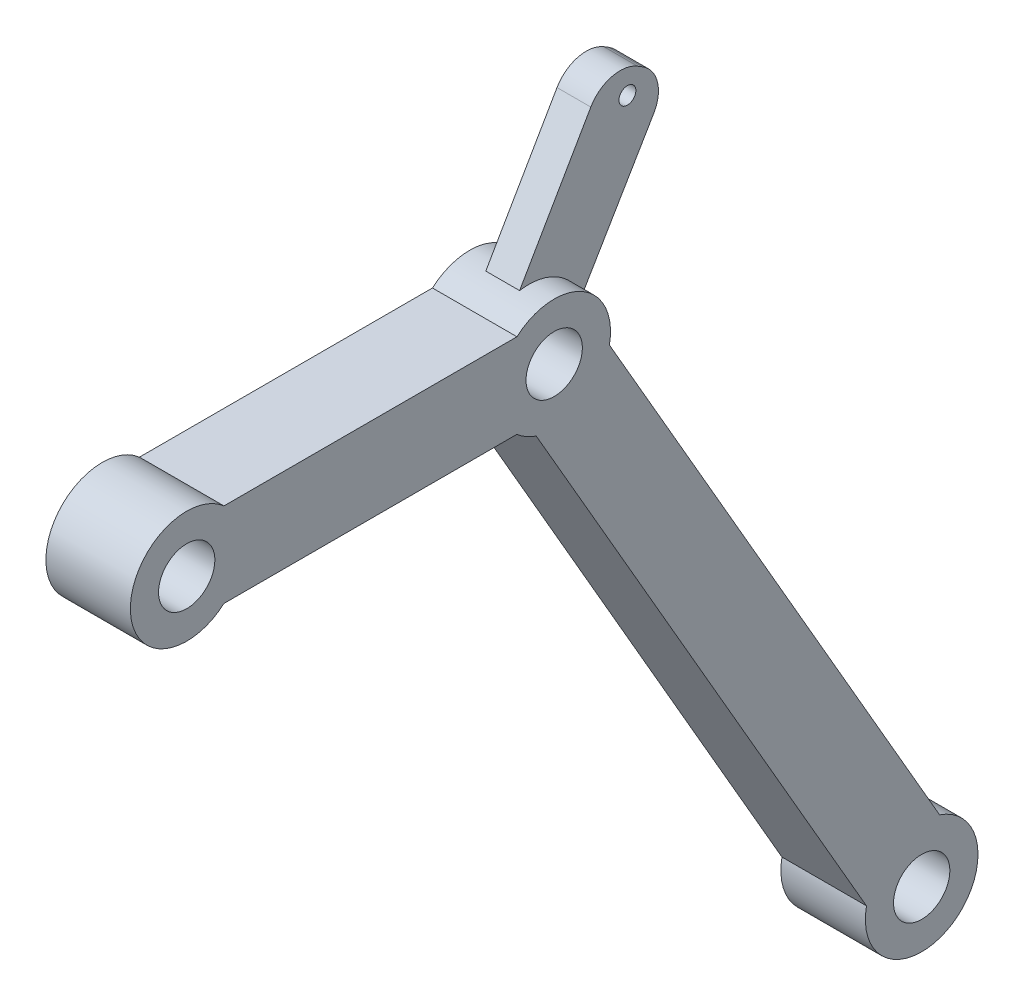
ISO-10303-21;
HEADER;
FILE_DESCRIPTION(('STEP AP214'),'2;1');
FILE_NAME('part.step','',(''),(''),'','','');
FILE_SCHEMA(('AUTOMOTIVE_DESIGN { 1 0 10303 214 1 1 1 1 }'));
ENDSEC;
DATA;
#1=APPLICATION_CONTEXT('core data for automotive mechanical design processes');
#2=APPLICATION_PROTOCOL_DEFINITION('international standard','automotive_design',2000,#1);
#3=PRODUCT_CONTEXT('',#1,'mechanical');
#4=PRODUCT('Part','Part','',(#3));
#5=PRODUCT_RELATED_PRODUCT_CATEGORY('part','',(#4));
#6=PRODUCT_DEFINITION_FORMATION('','',#4);
#7=PRODUCT_DEFINITION_CONTEXT('part definition',#1,'design');
#8=PRODUCT_DEFINITION('design','',#6,#7);
#9=PRODUCT_DEFINITION_SHAPE('','',#8);
#10=(LENGTH_UNIT() NAMED_UNIT(*) SI_UNIT(.MILLI.,.METRE.));
#11=(NAMED_UNIT(*) PLANE_ANGLE_UNIT() SI_UNIT($,.RADIAN.));
#12=(NAMED_UNIT(*) SI_UNIT($,.STERADIAN.) SOLID_ANGLE_UNIT());
#13=UNCERTAINTY_MEASURE_WITH_UNIT(LENGTH_MEASURE(1.E-05),#10,'distance_accuracy_value','');
#14=(GEOMETRIC_REPRESENTATION_CONTEXT(3) GLOBAL_UNCERTAINTY_ASSIGNED_CONTEXT((#13)) GLOBAL_UNIT_ASSIGNED_CONTEXT((#10,
#11,#12)) REPRESENTATION_CONTEXT('',''));
#15=CARTESIAN_POINT('',(0.,0.,0.));
#16=DIRECTION('',(0.,0.,1.));
#17=DIRECTION('',(1.,0.,0.));
#18=AXIS2_PLACEMENT_3D('',#15,#16,#17);
#19=CARTESIAN_POINT('',(-15.,0.,0.));
#20=DIRECTION('',(1.,0.,0.));
#21=DIRECTION('',(0.,1.,0.));
#22=AXIS2_PLACEMENT_3D('',#19,#20,#21);
#23=CYLINDRICAL_SURFACE('',#22,20.);
#24=CARTESIAN_POINT('',(6.,0.,0.));
#25=DIRECTION('',(1.,0.,0.));
#26=DIRECTION('',(0.,0.,-1.));
#27=AXIS2_PLACEMENT_3D('',#24,#25,#26);
#28=CIRCLE('',#27,20.);
#29=CARTESIAN_POINT('',(6.,19.7280323130776,3.28705659430512));
#30=VERTEX_POINT('',#29);
#31=CARTESIAN_POINT('',(6.,7.01734164219269,-18.7285054469583));
#32=VERTEX_POINT('',#31);
#33=EDGE_CURVE('E188',#30,#32,#28,.F.);
#34=ORIENTED_EDGE('',*,*,#33,.F.);
#35=DIRECTION('',(-1.,0.,0.));
#36=VECTOR('',#35,1.);
#37=CARTESIAN_POINT('',(6.,19.7280323130776,3.28705659430512));
#38=LINE('',#37,#36);
#39=CARTESIAN_POINT('',(-6.,19.7280323130776,3.28705659430513));
#40=VERTEX_POINT('',#39);
#41=EDGE_CURVE('E681',#30,#40,#38,.T.);
#42=ORIENTED_EDGE('',*,*,#41,.T.);
#43=CARTESIAN_POINT('',(-6.,0.,0.));
#44=DIRECTION('',(1.,0.,0.));
#45=DIRECTION('',(0.,0.,-1.));
#46=AXIS2_PLACEMENT_3D('',#43,#44,#45);
#47=CIRCLE('',#46,20.);
#48=CARTESIAN_POINT('',(-6.,7.01734164219269,-18.7285054469583));
#49=VERTEX_POINT('',#48);
#50=EDGE_CURVE('E200',#40,#49,#47,.F.);
#51=ORIENTED_EDGE('',*,*,#50,.T.);
#52=DIRECTION('',(-1.,0.,0.));
#53=VECTOR('',#52,1.);
#54=CARTESIAN_POINT('',(6.,7.01734164219269,-18.7285054469583));
#55=LINE('',#54,#53);
#56=EDGE_CURVE('E204',#32,#49,#55,.T.);
#57=ORIENTED_EDGE('',*,*,#56,.F.);
#58=EDGE_LOOP('',(#34,#42,#51,#57));
#59=FACE_BOUND('',#58,.T.);
#60=CARTESIAN_POINT('',(-15.,0.,0.));
#61=DIRECTION('',(1.,0.,0.));
#62=DIRECTION('',(0.,1.,0.));
#63=AXIS2_PLACEMENT_3D('',#60,#61,#62);
#64=CIRCLE('',#63,20.);
#65=CARTESIAN_POINT('',(-15.,-3.95643923738949,-19.6047593344281));
#66=VERTEX_POINT('',#65);
#67=CARTESIAN_POINT('',(-15.,15.,13.2287565553229));
#68=VERTEX_POINT('',#67);
#69=EDGE_CURVE('E274',#66,#68,#64,.T.);
#70=ORIENTED_EDGE('',*,*,#69,.T.);
#71=DIRECTION('',(1.,0.,0.));
#72=VECTOR('',#71,1.);
#73=CARTESIAN_POINT('',(-15.,15.,13.2287565553229));
#74=LINE('',#73,#72);
#75=CARTESIAN_POINT('',(15.,15.,13.2287565553229));
#76=VERTEX_POINT('',#75);
#77=EDGE_CURVE('E305',#76,#68,#74,.F.);
#78=ORIENTED_EDGE('',*,*,#77,.F.);
#79=CARTESIAN_POINT('',(15.,0.,0.));
#80=DIRECTION('',(1.,0.,0.));
#81=DIRECTION('',(0.,1.,0.));
#82=AXIS2_PLACEMENT_3D('',#79,#80,#81);
#83=CIRCLE('',#82,20.);
#84=CARTESIAN_POINT('',(15.,-3.95643923738949,-19.6047593344281));
#85=VERTEX_POINT('',#84);
#86=EDGE_CURVE('E273',#85,#76,#83,.T.);
#87=ORIENTED_EDGE('',*,*,#86,.F.);
#88=DIRECTION('',(1.,0.,0.));
#89=VECTOR('',#88,1.);
#90=CARTESIAN_POINT('',(-15.,-3.95643923738949,-19.6047593344281));
#91=LINE('',#90,#89);
#92=EDGE_CURVE('E307',#66,#85,#91,.T.);
#93=ORIENTED_EDGE('',*,*,#92,.F.);
#94=EDGE_LOOP('',(#70,#78,#87,#93));
#95=FACE_BOUND('',#94,.T.);
#96=ADVANCED_FACE('F38',(#59,#95),#23,.T.);
#97=CARTESIAN_POINT('',(-15.,0.836602540378331,17.803520777581));
#98=DIRECTION('',(0.,0.500000000000004,-0.866025403784436));
#99=DIRECTION('',(0.,0.866025403784436,0.500000000000004));
#100=AXIS2_PLACEMENT_3D('',#97,#98,#99);
#101=PLANE('',#100);
#102=DIRECTION('',(0.,-0.866025403784436,-0.500000000000004));
#103=VECTOR('',#102,1.);
#104=CARTESIAN_POINT('',(-15.,0.836602540378331,17.803520777581));
#105=LINE('',#104,#103);
#106=CARTESIAN_POINT('',(-15.,-18.9564392373896,6.37600277910499));
#107=VERTEX_POINT('',#106);
#108=CARTESIAN_POINT('',(-14.9999999999999,-222.076191150348,-110.895240665573));
#109=VERTEX_POINT('',#108);
#110=EDGE_CURVE('E349',#107,#109,#105,.T.);
#111=ORIENTED_EDGE('',*,*,#110,.T.);
#112=DIRECTION('',(1.,0.,0.));
#113=VECTOR('',#112,1.);
#114=CARTESIAN_POINT('',(-14.9999999999999,-222.076191150348,-110.895240665573));
#115=LINE('',#114,#113);
#116=CARTESIAN_POINT('',(15.0000000000001,-222.076191150348,-110.895240665573));
#117=VERTEX_POINT('',#116);
#118=EDGE_CURVE('E251',#109,#117,#115,.T.);
#119=ORIENTED_EDGE('',*,*,#118,.T.);
#120=DIRECTION('',(0.,-0.866025403784436,-0.500000000000004));
#121=VECTOR('',#120,1.);
#122=CARTESIAN_POINT('',(15.,0.836602540378331,17.803520777581));
#123=LINE('',#122,#121);
#124=CARTESIAN_POINT('',(15.,-18.9564392373896,6.37600277910499));
#125=VERTEX_POINT('',#124);
#126=EDGE_CURVE('E346',#125,#117,#123,.T.);
#127=ORIENTED_EDGE('',*,*,#126,.F.);
#128=DIRECTION('',(1.,0.,0.));
#129=VECTOR('',#128,1.);
#130=CARTESIAN_POINT('',(-15.,-18.9564392373896,6.37600277910498));
#131=LINE('',#130,#129);
#132=EDGE_CURVE('E309',#125,#107,#131,.F.);
#133=ORIENTED_EDGE('',*,*,#132,.T.);
#134=EDGE_LOOP('',(#111,#119,#127,#133));
#135=FACE_BOUND('',#134,.T.);
#136=ADVANCED_FACE('F403',(#135),#101,.F.);
#137=CARTESIAN_POINT('',(-15.,15.8366025403785,-8.17724133595211));
#138=DIRECTION('',(0.,-0.500000000000004,0.866025403784436));
#139=DIRECTION('',(0.,-0.866025403784436,-0.500000000000004));
#140=AXIS2_PLACEMENT_3D('',#137,#138,#139);
#141=PLANE('',#140);
#142=DIRECTION('',(0.,-0.866025403784436,-0.500000000000004));
#143=VECTOR('',#142,1.);
#144=CARTESIAN_POINT('',(15.,15.8366025403785,-8.17724133595211));
#145=LINE('',#144,#143);
#146=CARTESIAN_POINT('',(15.,-207.076191150348,-136.876002779106));
#147=VERTEX_POINT('',#146);
#148=EDGE_CURVE('E312',#85,#147,#145,.T.);
#149=ORIENTED_EDGE('',*,*,#148,.T.);
#150=DIRECTION('',(1.,0.,0.));
#151=VECTOR('',#150,1.);
#152=CARTESIAN_POINT('',(-14.9999999999999,-207.076191150348,-136.876002779106));
#153=LINE('',#152,#151);
#154=CARTESIAN_POINT('',(-14.9999999999999,-207.076191150348,-136.876002779106));
#155=VERTEX_POINT('',#154);
#156=EDGE_CURVE('E248',#147,#155,#153,.F.);
#157=ORIENTED_EDGE('',*,*,#156,.T.);
#158=DIRECTION('',(0.,-0.866025403784436,-0.500000000000004));
#159=VECTOR('',#158,1.);
#160=CARTESIAN_POINT('',(-15.,15.8366025403785,-8.17724133595211));
#161=LINE('',#160,#159);
#162=EDGE_CURVE('E341',#66,#155,#161,.T.);
#163=ORIENTED_EDGE('',*,*,#162,.F.);
#164=ORIENTED_EDGE('',*,*,#92,.T.);
#165=EDGE_LOOP('',(#149,#157,#163,#164));
#166=FACE_BOUND('',#165,.T.);
#167=ADVANCED_FACE('F40',(#166),#141,.F.);
#168=CARTESIAN_POINT('',(-15.,15.,130.5));
#169=DIRECTION('',(0.,-1.,0.));
#170=DIRECTION('',(0.,0.,-1.));
#171=AXIS2_PLACEMENT_3D('',#168,#169,#170);
#172=PLANE('',#171);
#173=DIRECTION('',(0.,0.,-1.));
#174=VECTOR('',#173,1.);
#175=CARTESIAN_POINT('',(-15.,15.,130.5));
#176=LINE('',#175,#174);
#177=CARTESIAN_POINT('',(-15.,15.,117.271243444677));
#178=VERTEX_POINT('',#177);
#179=EDGE_CURVE('E338',#178,#68,#176,.T.);
#180=ORIENTED_EDGE('',*,*,#179,.F.);
#181=DIRECTION('',(1.,0.,0.));
#182=VECTOR('',#181,1.);
#183=CARTESIAN_POINT('',(-15.,15.,117.271243444677));
#184=LINE('',#183,#182);
#185=CARTESIAN_POINT('',(15.,15.,117.271243444677));
#186=VERTEX_POINT('',#185);
#187=EDGE_CURVE('E271',#178,#186,#184,.T.);
#188=ORIENTED_EDGE('',*,*,#187,.T.);
#189=DIRECTION('',(0.,0.,-1.));
#190=VECTOR('',#189,1.);
#191=CARTESIAN_POINT('',(15.,15.,130.5));
#192=LINE('',#191,#190);
#193=EDGE_CURVE('E327',#186,#76,#192,.T.);
#194=ORIENTED_EDGE('',*,*,#193,.T.);
#195=ORIENTED_EDGE('',*,*,#77,.T.);
#196=EDGE_LOOP('',(#180,#188,#194,#195));
#197=FACE_BOUND('',#196,.T.);
#198=ADVANCED_FACE('F437',(#197),#172,.F.);
#199=CARTESIAN_POINT('',(15.,15.,130.5));
#200=DIRECTION('',(-1.,0.,0.));
#201=DIRECTION('',(0.,-1.,0.));
#202=AXIS2_PLACEMENT_3D('',#199,#200,#201);
#203=PLANE('',#202);
#204=CARTESIAN_POINT('',(15.0000000000001,-226.032630387738,-130.500000000001));
#205=DIRECTION('',(1.,0.,0.));
#206=DIRECTION('',(0.,1.,0.));
#207=AXIS2_PLACEMENT_3D('',#204,#205,#206);
#208=CIRCLE('',#207,10.);
#209=CARTESIAN_POINT('',(15.0000000000001,-216.032630387738,-130.500000000001));
#210=VERTEX_POINT('',#209);
#211=EDGE_CURVE('E199',#210,#210,#208,.T.);
#212=ORIENTED_EDGE('',*,*,#211,.F.);
#213=EDGE_LOOP('',(#212));
#214=FACE_BOUND('',#213,.T.);
#215=CARTESIAN_POINT('',(15.,0.,130.5));
#216=DIRECTION('',(1.,0.,0.));
#217=DIRECTION('',(0.,1.,0.));
#218=AXIS2_PLACEMENT_3D('',#215,#216,#217);
#219=CIRCLE('',#218,9.99999999999999);
#220=CARTESIAN_POINT('',(15.,9.99999999999999,130.5));
#221=VERTEX_POINT('',#220);
#222=EDGE_CURVE('E223',#221,#221,#219,.T.);
#223=ORIENTED_EDGE('',*,*,#222,.F.);
#224=EDGE_LOOP('',(#223));
#225=FACE_BOUND('',#224,.T.);
#226=CARTESIAN_POINT('',(15.,0.,0.));
#227=DIRECTION('',(1.,0.,0.));
#228=DIRECTION('',(0.,1.,0.));
#229=AXIS2_PLACEMENT_3D('',#226,#227,#228);
#230=CIRCLE('',#229,10.);
#231=CARTESIAN_POINT('',(15.,10.,0.));
#232=VERTEX_POINT('',#231);
#233=EDGE_CURVE('E222',#232,#232,#230,.T.);
#234=ORIENTED_EDGE('',*,*,#233,.F.);
#235=EDGE_LOOP('',(#234));
#236=FACE_BOUND('',#235,.T.);
#237=CARTESIAN_POINT('',(15.0000000000001,-226.032630387738,-130.500000000001));
#238=DIRECTION('',(1.,0.,0.));
#239=DIRECTION('',(0.,1.,0.));
#240=AXIS2_PLACEMENT_3D('',#237,#238,#239);
#241=CIRCLE('',#240,20.);
#242=EDGE_CURVE('E234',#117,#147,#241,.T.);
#243=ORIENTED_EDGE('',*,*,#242,.T.);
#244=ORIENTED_EDGE('',*,*,#148,.F.);
#245=ORIENTED_EDGE('',*,*,#86,.T.);
#246=ORIENTED_EDGE('',*,*,#193,.F.);
#247=CARTESIAN_POINT('',(15.,0.,130.5));
#248=DIRECTION('',(1.,0.,0.));
#249=DIRECTION('',(0.,1.,0.));
#250=AXIS2_PLACEMENT_3D('',#247,#248,#249);
#251=CIRCLE('',#250,20.);
#252=CARTESIAN_POINT('',(15.,-15.,117.271243444677));
#253=VERTEX_POINT('',#252);
#254=EDGE_CURVE('E254',#186,#253,#251,.T.);
#255=ORIENTED_EDGE('',*,*,#254,.T.);
#256=DIRECTION('',(0.,0.,-1.));
#257=VECTOR('',#256,1.);
#258=CARTESIAN_POINT('',(15.,-15.,130.5));
#259=LINE('',#258,#257);
#260=CARTESIAN_POINT('',(15.,-15.,13.228756555323));
#261=VERTEX_POINT('',#260);
#262=EDGE_CURVE('E337',#253,#261,#259,.T.);
#263=ORIENTED_EDGE('',*,*,#262,.T.);
#264=EDGE_CURVE('E278',#261,#125,#83,.T.);
#265=ORIENTED_EDGE('',*,*,#264,.T.);
#266=ORIENTED_EDGE('',*,*,#126,.T.);
#267=EDGE_LOOP('',(#243,#244,#245,#246,#255,#263,#265,#266));
#268=FACE_BOUND('',#267,.T.);
#269=ADVANCED_FACE('F429',(#214,#225,#236,#268),#203,.F.);
#270=CARTESIAN_POINT('',(-15.,-15.,130.5));
#271=DIRECTION('',(0.,1.,0.));
#272=DIRECTION('',(0.,0.,1.));
#273=AXIS2_PLACEMENT_3D('',#270,#271,#272);
#274=PLANE('',#273);
#275=ORIENTED_EDGE('',*,*,#262,.F.);
#276=DIRECTION('',(1.,0.,0.));
#277=VECTOR('',#276,1.);
#278=CARTESIAN_POINT('',(-15.,-15.,117.271243444677));
#279=LINE('',#278,#277);
#280=CARTESIAN_POINT('',(-15.,-15.,117.271243444677));
#281=VERTEX_POINT('',#280);
#282=EDGE_CURVE('E269',#253,#281,#279,.F.);
#283=ORIENTED_EDGE('',*,*,#282,.T.);
#284=DIRECTION('',(0.,0.,-1.));
#285=VECTOR('',#284,1.);
#286=CARTESIAN_POINT('',(-15.,-15.,130.5));
#287=LINE('',#286,#285);
#288=CARTESIAN_POINT('',(-15.,-15.,13.228756555323));
#289=VERTEX_POINT('',#288);
#290=EDGE_CURVE('E335',#281,#289,#287,.T.);
#291=ORIENTED_EDGE('',*,*,#290,.T.);
#292=DIRECTION('',(1.,0.,0.));
#293=VECTOR('',#292,1.);
#294=CARTESIAN_POINT('',(-15.,-15.,13.228756555323));
#295=LINE('',#294,#293);
#296=EDGE_CURVE('E302',#289,#261,#295,.T.);
#297=ORIENTED_EDGE('',*,*,#296,.T.);
#298=EDGE_LOOP('',(#275,#283,#291,#297));
#299=FACE_BOUND('',#298,.T.);
#300=ADVANCED_FACE('F423',(#299),#274,.F.);
#301=CARTESIAN_POINT('',(-15.,15.,130.5));
#302=DIRECTION('',(1.,0.,0.));
#303=DIRECTION('',(0.,0.,-1.));
#304=AXIS2_PLACEMENT_3D('',#301,#302,#303);
#305=PLANE('',#304);
#306=CARTESIAN_POINT('',(-14.9999999999999,-226.032630387738,-130.500000000001));
#307=DIRECTION('',(1.,0.,0.));
#308=DIRECTION('',(0.,1.,0.));
#309=AXIS2_PLACEMENT_3D('',#306,#307,#308);
#310=CIRCLE('',#309,10.);
#311=CARTESIAN_POINT('',(-14.9999999999999,-216.032630387738,-130.500000000001));
#312=VERTEX_POINT('',#311);
#313=EDGE_CURVE('E226',#312,#312,#310,.T.);
#314=ORIENTED_EDGE('',*,*,#313,.T.);
#315=EDGE_LOOP('',(#314));
#316=FACE_BOUND('',#315,.T.);
#317=CARTESIAN_POINT('',(-15.,0.,130.5));
#318=DIRECTION('',(1.,0.,0.));
#319=DIRECTION('',(0.,1.,0.));
#320=AXIS2_PLACEMENT_3D('',#317,#318,#319);
#321=CIRCLE('',#320,9.99999999999999);
#322=CARTESIAN_POINT('',(-15.,9.99999999999998,130.5));
#323=VERTEX_POINT('',#322);
#324=EDGE_CURVE('E219',#323,#323,#321,.T.);
#325=ORIENTED_EDGE('',*,*,#324,.T.);
#326=EDGE_LOOP('',(#325));
#327=FACE_BOUND('',#326,.T.);
#328=CARTESIAN_POINT('',(-15.,0.,0.));
#329=DIRECTION('',(1.,0.,0.));
#330=DIRECTION('',(0.,1.,0.));
#331=AXIS2_PLACEMENT_3D('',#328,#329,#330);
#332=CIRCLE('',#331,10.);
#333=CARTESIAN_POINT('',(-15.,10.,0.));
#334=VERTEX_POINT('',#333);
#335=EDGE_CURVE('E231',#334,#334,#332,.T.);
#336=ORIENTED_EDGE('',*,*,#335,.T.);
#337=EDGE_LOOP('',(#336));
#338=FACE_BOUND('',#337,.T.);
#339=ORIENTED_EDGE('',*,*,#162,.T.);
#340=CARTESIAN_POINT('',(-14.9999999999999,-226.032630387738,-130.500000000001));
#341=DIRECTION('',(1.,0.,0.));
#342=DIRECTION('',(0.,1.,0.));
#343=AXIS2_PLACEMENT_3D('',#340,#341,#342);
#344=CIRCLE('',#343,20.);
#345=EDGE_CURVE('E237',#109,#155,#344,.T.);
#346=ORIENTED_EDGE('',*,*,#345,.F.);
#347=ORIENTED_EDGE('',*,*,#110,.F.);
#348=EDGE_CURVE('E277',#289,#107,#64,.T.);
#349=ORIENTED_EDGE('',*,*,#348,.F.);
#350=ORIENTED_EDGE('',*,*,#290,.F.);
#351=CARTESIAN_POINT('',(-15.,0.,130.5));
#352=DIRECTION('',(1.,0.,0.));
#353=DIRECTION('',(0.,1.,0.));
#354=AXIS2_PLACEMENT_3D('',#351,#352,#353);
#355=CIRCLE('',#354,20.);
#356=EDGE_CURVE('E255',#178,#281,#355,.T.);
#357=ORIENTED_EDGE('',*,*,#356,.F.);
#358=ORIENTED_EDGE('',*,*,#179,.T.);
#359=ORIENTED_EDGE('',*,*,#69,.F.);
#360=EDGE_LOOP('',(#339,#346,#347,#349,#350,#357,#358,#359));
#361=FACE_BOUND('',#360,.T.);
#362=ADVANCED_FACE('F401',(#316,#327,#338,#361),#305,.F.);
#363=ORIENTED_EDGE('',*,*,#132,.F.);
#364=ORIENTED_EDGE('',*,*,#264,.F.);
#365=ORIENTED_EDGE('',*,*,#296,.F.);
#366=ORIENTED_EDGE('',*,*,#348,.T.);
#367=EDGE_LOOP('',(#363,#364,#365,#366));
#368=FACE_BOUND('',#367,.T.);
#369=ADVANCED_FACE('F390',(#368),#23,.T.);
#370=CARTESIAN_POINT('',(-15.,0.,130.5));
#371=DIRECTION('',(1.,0.,0.));
#372=DIRECTION('',(0.,1.,0.));
#373=AXIS2_PLACEMENT_3D('',#370,#371,#372);
#374=CYLINDRICAL_SURFACE('',#373,20.);
#375=ORIENTED_EDGE('',*,*,#187,.F.);
#376=ORIENTED_EDGE('',*,*,#356,.T.);
#377=ORIENTED_EDGE('',*,*,#282,.F.);
#378=ORIENTED_EDGE('',*,*,#254,.F.);
#379=EDGE_LOOP('',(#375,#376,#377,#378));
#380=FACE_BOUND('',#379,.T.);
#381=ADVANCED_FACE('F379',(#380),#374,.T.);
#382=CARTESIAN_POINT('',(-14.9999999999999,-226.032630387738,-130.500000000001));
#383=DIRECTION('',(1.,0.,0.));
#384=DIRECTION('',(0.,1.,0.));
#385=AXIS2_PLACEMENT_3D('',#382,#383,#384);
#386=CYLINDRICAL_SURFACE('',#385,20.);
#387=ORIENTED_EDGE('',*,*,#118,.F.);
#388=ORIENTED_EDGE('',*,*,#345,.T.);
#389=ORIENTED_EDGE('',*,*,#156,.F.);
#390=ORIENTED_EDGE('',*,*,#242,.F.);
#391=EDGE_LOOP('',(#387,#388,#389,#390));
#392=FACE_BOUND('',#391,.T.);
#393=ADVANCED_FACE('F389',(#392),#386,.T.);
#394=CARTESIAN_POINT('',(-15.,0.,0.));
#395=DIRECTION('',(1.,0.,0.));
#396=DIRECTION('',(0.,1.,0.));
#397=AXIS2_PLACEMENT_3D('',#394,#395,#396);
#398=CYLINDRICAL_SURFACE('',#397,10.);
#399=ORIENTED_EDGE('',*,*,#233,.T.);
#400=EDGE_LOOP('',(#399));
#401=FACE_BOUND('',#400,.T.);
#402=ORIENTED_EDGE('',*,*,#335,.F.);
#403=EDGE_LOOP('',(#402));
#404=FACE_BOUND('',#403,.T.);
#405=ADVANCED_FACE('F467',(#401,#404),#398,.F.);
#406=CARTESIAN_POINT('',(-15.,0.,130.5));
#407=DIRECTION('',(1.,0.,0.));
#408=DIRECTION('',(0.,1.,0.));
#409=AXIS2_PLACEMENT_3D('',#406,#407,#408);
#410=CYLINDRICAL_SURFACE('',#409,9.99999999999999);
#411=ORIENTED_EDGE('',*,*,#324,.F.);
#412=EDGE_LOOP('',(#411));
#413=FACE_BOUND('',#412,.T.);
#414=ORIENTED_EDGE('',*,*,#222,.T.);
#415=EDGE_LOOP('',(#414));
#416=FACE_BOUND('',#415,.T.);
#417=ADVANCED_FACE('F472',(#413,#416),#410,.F.);
#418=CARTESIAN_POINT('',(-14.9999999999999,-226.032630387738,-130.500000000001));
#419=DIRECTION('',(1.,0.,0.));
#420=DIRECTION('',(0.,1.,0.));
#421=AXIS2_PLACEMENT_3D('',#418,#419,#420);
#422=CYLINDRICAL_SURFACE('',#421,10.);
#423=ORIENTED_EDGE('',*,*,#313,.F.);
#424=EDGE_LOOP('',(#423));
#425=FACE_BOUND('',#424,.T.);
#426=ORIENTED_EDGE('',*,*,#211,.T.);
#427=EDGE_LOOP('',(#426));
#428=FACE_BOUND('',#427,.T.);
#429=ADVANCED_FACE('F572',(#425,#428),#422,.F.);
#430=CARTESIAN_POINT('',(6.,0.,0.));
#431=DIRECTION('',(1.,0.,0.));
#432=DIRECTION('',(0.,0.,-1.));
#433=AXIS2_PLACEMENT_3D('',#430,#431,#432);
#434=PLANE('',#433);
#435=DIRECTION('',(0.,-0.86602540378444,0.499999999999998));
#436=VECTOR('',#435,1.);
#437=CARTESIAN_POINT('',(6.,19.7280323130776,3.28705659430512));
#438=LINE('',#437,#436);
#439=CARTESIAN_POINT('',(6.,63.5269656760281,-22.0002693730127));
#440=VERTEX_POINT('',#439);
#441=EDGE_CURVE('E195',#440,#30,#438,.T.);
#442=ORIENTED_EDGE('',*,*,#441,.T.);
#443=ORIENTED_EDGE('',*,*,#33,.T.);
#444=DIRECTION('',(0.,0.861010443447098,-0.508587274983391));
#445=VECTOR('',#444,1.);
#446=CARTESIAN_POINT('',(6.,50.4217740311825,-44.366919195506));
#447=LINE('',#446,#445);
#448=CARTESIAN_POINT('',(6.,50.4217740311825,-44.366919195506));
#449=VERTEX_POINT('',#448);
#450=EDGE_CURVE('E192',#32,#449,#447,.T.);
#451=ORIENTED_EDGE('',*,*,#450,.T.);
#452=CARTESIAN_POINT('',(6.,56.5248213309832,-34.0347938741408));
#453=DIRECTION('',(1.,0.,0.));
#454=DIRECTION('',(0.,0.,1.));
#455=AXIS2_PLACEMENT_3D('',#452,#453,#454);
#456=CIRCLE('',#455,12.);
#457=CARTESIAN_POINT('',(6.,66.7681820276705,-40.2856787425064));
#458=VERTEX_POINT('',#457);
#459=EDGE_CURVE('E209',#449,#458,#456,.T.);
#460=ORIENTED_EDGE('',*,*,#459,.T.);
#461=DIRECTION('',(0.,0.520907072363805,0.853613391390605));
#462=VECTOR('',#461,1.);
#463=CARTESIAN_POINT('',(6.,67.7703263727155,-38.6434590867915));
#464=LINE('',#463,#462);
#465=CARTESIAN_POINT('',(6.,67.7703263727155,-38.6434590867915));
#466=VERTEX_POINT('',#465);
#467=EDGE_CURVE('E676',#458,#466,#464,.T.);
#468=ORIENTED_EDGE('',*,*,#467,.T.);
#469=CARTESIAN_POINT('',(6.,57.5269656760282,-32.3925742184259));
#470=DIRECTION('',(1.,0.,0.));
#471=DIRECTION('',(0.,0.,1.));
#472=AXIS2_PLACEMENT_3D('',#469,#470,#471);
#473=CIRCLE('',#472,12.);
#474=EDGE_CURVE('E678',#466,#440,#473,.T.);
#475=ORIENTED_EDGE('',*,*,#474,.T.);
#476=EDGE_LOOP('',(#442,#443,#451,#460,#468,#475));
#477=FACE_BOUND('',#476,.T.);
#478=CARTESIAN_POINT('',(6.,60.6217782649108,-34.9999999999998));
#479=DIRECTION('',(1.,0.,0.));
#480=DIRECTION('',(0.,0.,-1.));
#481=AXIS2_PLACEMENT_3D('',#478,#479,#480);
#482=CIRCLE('',#481,3.);
#483=CARTESIAN_POINT('',(6.,60.6217782649108,-37.9999999999998));
#484=VERTEX_POINT('',#483);
#485=EDGE_CURVE('E666',#484,#484,#482,.T.);
#486=ORIENTED_EDGE('',*,*,#485,.F.);
#487=EDGE_LOOP('',(#486));
#488=FACE_BOUND('',#487,.T.);
#489=ADVANCED_FACE('F190',(#477,#488),#434,.T.);
#490=CARTESIAN_POINT('',(-6.,0.,0.));
#491=DIRECTION('',(1.,0.,0.));
#492=DIRECTION('',(0.,0.,-1.));
#493=AXIS2_PLACEMENT_3D('',#490,#491,#492);
#494=PLANE('',#493);
#495=ORIENTED_EDGE('',*,*,#50,.F.);
#496=DIRECTION('',(0.,-0.86602540378444,0.499999999999998));
#497=VECTOR('',#496,1.);
#498=CARTESIAN_POINT('',(-6.,19.7280323130776,3.28705659430512));
#499=LINE('',#498,#497);
#500=CARTESIAN_POINT('',(-6.,63.5269656760281,-22.0002693730127));
#501=VERTEX_POINT('',#500);
#502=EDGE_CURVE('E54',#501,#40,#499,.T.);
#503=ORIENTED_EDGE('',*,*,#502,.F.);
#504=CARTESIAN_POINT('',(-6.,57.5269656760282,-32.3925742184259));
#505=DIRECTION('',(1.,0.,0.));
#506=DIRECTION('',(0.,0.,1.));
#507=AXIS2_PLACEMENT_3D('',#504,#505,#506);
#508=CIRCLE('',#507,12.);
#509=CARTESIAN_POINT('',(-6.,67.7703263727155,-38.6434590867915));
#510=VERTEX_POINT('',#509);
#511=EDGE_CURVE('E687',#510,#501,#508,.T.);
#512=ORIENTED_EDGE('',*,*,#511,.F.);
#513=DIRECTION('',(0.,0.520907072363805,0.853613391390605));
#514=VECTOR('',#513,1.);
#515=CARTESIAN_POINT('',(-6.,67.7703263727155,-38.6434590867915));
#516=LINE('',#515,#514);
#517=CARTESIAN_POINT('',(-6.,66.7681820276705,-40.2856787425064));
#518=VERTEX_POINT('',#517);
#519=EDGE_CURVE('E685',#518,#510,#516,.T.);
#520=ORIENTED_EDGE('',*,*,#519,.F.);
#521=CARTESIAN_POINT('',(-6.,56.5248213309832,-34.0347938741408));
#522=DIRECTION('',(1.,0.,0.));
#523=DIRECTION('',(0.,0.,1.));
#524=AXIS2_PLACEMENT_3D('',#521,#522,#523);
#525=CIRCLE('',#524,12.);
#526=CARTESIAN_POINT('',(-6.,50.4217740311825,-44.366919195506));
#527=VERTEX_POINT('',#526);
#528=EDGE_CURVE('E683',#527,#518,#525,.T.);
#529=ORIENTED_EDGE('',*,*,#528,.F.);
#530=DIRECTION('',(0.,0.861010443447098,-0.508587274983391));
#531=VECTOR('',#530,1.);
#532=CARTESIAN_POINT('',(-6.,50.4217740311825,-44.366919195506));
#533=LINE('',#532,#531);
#534=EDGE_CURVE('E672',#49,#527,#533,.T.);
#535=ORIENTED_EDGE('',*,*,#534,.F.);
#536=EDGE_LOOP('',(#495,#503,#512,#520,#529,#535));
#537=FACE_BOUND('',#536,.T.);
#538=CARTESIAN_POINT('',(-6.,60.6217782649108,-34.9999999999998));
#539=DIRECTION('',(1.,0.,0.));
#540=DIRECTION('',(0.,0.,-1.));
#541=AXIS2_PLACEMENT_3D('',#538,#539,#540);
#542=CIRCLE('',#541,3.);
#543=CARTESIAN_POINT('',(-6.,60.6217782649108,-37.9999999999998));
#544=VERTEX_POINT('',#543);
#545=EDGE_CURVE('E669',#544,#544,#542,.T.);
#546=ORIENTED_EDGE('',*,*,#545,.T.);
#547=EDGE_LOOP('',(#546));
#548=FACE_BOUND('',#547,.T.);
#549=ADVANCED_FACE('F594',(#537,#548),#494,.F.);
#550=CARTESIAN_POINT('',(6.,50.4217740311825,-44.366919195506));
#551=DIRECTION('',(0.,0.508587274983391,0.861010443447098));
#552=DIRECTION('',(0.,-0.861010443447098,0.508587274983391));
#553=AXIS2_PLACEMENT_3D('',#550,#551,#552);
#554=PLANE('',#553);
#555=ORIENTED_EDGE('',*,*,#534,.T.);
#556=DIRECTION('',(-1.,0.,0.));
#557=VECTOR('',#556,1.);
#558=CARTESIAN_POINT('',(6.,50.4217740311825,-44.366919195506));
#559=LINE('',#558,#557);
#560=EDGE_CURVE('E207',#449,#527,#559,.T.);
#561=ORIENTED_EDGE('',*,*,#560,.F.);
#562=ORIENTED_EDGE('',*,*,#450,.F.);
#563=ORIENTED_EDGE('',*,*,#56,.T.);
#564=EDGE_LOOP('',(#555,#561,#562,#563));
#565=FACE_BOUND('',#564,.T.);
#566=ADVANCED_FACE('F203',(#565),#554,.F.);
#567=CARTESIAN_POINT('',(6.,56.5248213309832,-34.0347938741408));
#568=DIRECTION('',(-1.,0.,0.));
#569=DIRECTION('',(0.,0.,1.));
#570=AXIS2_PLACEMENT_3D('',#567,#568,#569);
#571=CYLINDRICAL_SURFACE('',#570,12.);
#572=ORIENTED_EDGE('',*,*,#528,.T.);
#573=DIRECTION('',(-1.,0.,0.));
#574=VECTOR('',#573,1.);
#575=CARTESIAN_POINT('',(6.,66.7681820276705,-40.2856787425064));
#576=LINE('',#575,#574);
#577=EDGE_CURVE('E215',#458,#518,#576,.T.);
#578=ORIENTED_EDGE('',*,*,#577,.F.);
#579=ORIENTED_EDGE('',*,*,#459,.F.);
#580=ORIENTED_EDGE('',*,*,#560,.T.);
#581=EDGE_LOOP('',(#572,#578,#579,#580));
#582=FACE_BOUND('',#581,.T.);
#583=ADVANCED_FACE('F610',(#582),#571,.T.);
#584=CARTESIAN_POINT('',(6.,67.7703263727155,-38.6434590867915));
#585=DIRECTION('',(0.,-0.853613391390605,0.520907072363805));
#586=DIRECTION('',(0.,-0.520907072363805,-0.853613391390605));
#587=AXIS2_PLACEMENT_3D('',#584,#585,#586);
#588=PLANE('',#587);
#589=ORIENTED_EDGE('',*,*,#519,.T.);
#590=DIRECTION('',(-1.,0.,0.));
#591=VECTOR('',#590,1.);
#592=CARTESIAN_POINT('',(6.,67.7703263727155,-38.6434590867915));
#593=LINE('',#592,#591);
#594=EDGE_CURVE('E693',#466,#510,#593,.T.);
#595=ORIENTED_EDGE('',*,*,#594,.F.);
#596=ORIENTED_EDGE('',*,*,#467,.F.);
#597=ORIENTED_EDGE('',*,*,#577,.T.);
#598=EDGE_LOOP('',(#589,#595,#596,#597));
#599=FACE_BOUND('',#598,.T.);
#600=ADVANCED_FACE('F618',(#599),#588,.F.);
#601=CARTESIAN_POINT('',(6.,57.5269656760282,-32.3925742184259));
#602=DIRECTION('',(-1.,0.,0.));
#603=DIRECTION('',(0.,0.,1.));
#604=AXIS2_PLACEMENT_3D('',#601,#602,#603);
#605=CYLINDRICAL_SURFACE('',#604,12.);
#606=ORIENTED_EDGE('',*,*,#511,.T.);
#607=DIRECTION('',(-1.,0.,0.));
#608=VECTOR('',#607,1.);
#609=CARTESIAN_POINT('',(6.,63.5269656760281,-22.0002693730127));
#610=LINE('',#609,#608);
#611=EDGE_CURVE('E691',#440,#501,#610,.T.);
#612=ORIENTED_EDGE('',*,*,#611,.F.);
#613=ORIENTED_EDGE('',*,*,#474,.F.);
#614=ORIENTED_EDGE('',*,*,#594,.T.);
#615=EDGE_LOOP('',(#606,#612,#613,#614));
#616=FACE_BOUND('',#615,.T.);
#617=ADVANCED_FACE('F627',(#616),#605,.T.);
#618=CARTESIAN_POINT('',(6.,19.7280323130776,3.28705659430512));
#619=DIRECTION('',(0.,-0.499999999999998,-0.86602540378444));
#620=DIRECTION('',(0.,0.86602540378444,-0.499999999999998));
#621=AXIS2_PLACEMENT_3D('',#618,#619,#620);
#622=PLANE('',#621);
#623=ORIENTED_EDGE('',*,*,#502,.T.);
#624=ORIENTED_EDGE('',*,*,#41,.F.);
#625=ORIENTED_EDGE('',*,*,#441,.F.);
#626=ORIENTED_EDGE('',*,*,#611,.T.);
#627=EDGE_LOOP('',(#623,#624,#625,#626));
#628=FACE_BOUND('',#627,.T.);
#629=ADVANCED_FACE('F636',(#628),#622,.F.);
#630=CARTESIAN_POINT('',(6.,60.6217782649108,-34.9999999999998));
#631=DIRECTION('',(-1.,0.,0.));
#632=DIRECTION('',(0.,0.,1.));
#633=AXIS2_PLACEMENT_3D('',#630,#631,#632);
#634=CYLINDRICAL_SURFACE('',#633,3.);
#635=ORIENTED_EDGE('',*,*,#485,.T.);
#636=EDGE_LOOP('',(#635));
#637=FACE_BOUND('',#636,.T.);
#638=ORIENTED_EDGE('',*,*,#545,.F.);
#639=EDGE_LOOP('',(#638));
#640=FACE_BOUND('',#639,.T.);
#641=ADVANCED_FACE('F645',(#637,#640),#634,.F.);
#642=CLOSED_SHELL('',(#96,#136,#167,#198,#269,#300,#362,#369,#381,#393,#405,#417,#429,#489,#549,
#566,#583,#600,#617,#629,#641));
#643=CARTESIAN_POINT('',(12.5,0.,0.));
#644=DIRECTION('',(1.,0.,0.));
#645=DIRECTION('',(0.,0.,-1.));
#646=AXIS2_PLACEMENT_3D('',#643,#644,#645);
#647=CIRCLE('',#646,20.);
#648=CARTESIAN_POINT('',(12.5,-19.77081728299,3.01907004930736));
#649=VERTEX_POINT('',#648);
#650=CARTESIAN_POINT('',(12.5,-7.27081728298985,-18.6315650453035));
#651=VERTEX_POINT('',#650);
#652=EDGE_CURVE('E299',#649,#651,#647,.T.);
#653=ORIENTED_EDGE('',*,*,#652,.F.);
#654=DIRECTION('',(1.,0.,0.));
#655=VECTOR('',#654,1.);
#656=CARTESIAN_POINT('',(-15.,-19.77081728299,3.01907004930736));
#657=LINE('',#656,#655);
#658=CARTESIAN_POINT('',(-12.5,-19.77081728299,3.01907004930736));
#659=VERTEX_POINT('',#658);
#660=EDGE_CURVE('E296',#659,#649,#657,.T.);
#661=ORIENTED_EDGE('',*,*,#660,.F.);
#662=CARTESIAN_POINT('',(-12.5,0.,0.));
#663=DIRECTION('',(-1.,0.,0.));
#664=DIRECTION('',(0.,0.,1.));
#665=AXIS2_PLACEMENT_3D('',#662,#663,#664);
#666=CIRCLE('',#665,20.);
#667=CARTESIAN_POINT('',(-12.5,-7.27081728298985,-18.6315650453035));
#668=VERTEX_POINT('',#667);
#669=EDGE_CURVE('E293',#668,#659,#666,.T.);
#670=ORIENTED_EDGE('',*,*,#669,.F.);
#671=DIRECTION('',(1.,0.,0.));
#672=VECTOR('',#671,1.);
#673=CARTESIAN_POINT('',(-15.,-7.27081728298986,-18.6315650453035));
#674=LINE('',#673,#672);
#675=EDGE_CURVE('E290',#651,#668,#674,.F.);
#676=ORIENTED_EDGE('',*,*,#675,.F.);
#677=EDGE_LOOP('',(#653,#661,#670,#676));
#678=FACE_BOUND('',#677,.T.);
#679=ADVANCED_FACE('F394',(#678),#23,.T.);
#680=CARTESIAN_POINT('',(-12.5,13.2116025403785,-6.80603444662677));
#681=DIRECTION('',(0.,0.500000000000004,-0.866025403784436));
#682=DIRECTION('',(0.,0.866025403784436,0.500000000000004));
#683=AXIS2_PLACEMENT_3D('',#680,#681,#682);
#684=PLANE('',#683);
#685=DIRECTION('',(0.,-0.866025403784436,-0.500000000000004));
#686=VECTOR('',#685,1.);
#687=CARTESIAN_POINT('',(-12.5,13.2116025403785,-6.80603444662677));
#688=LINE('',#687,#686);
#689=CARTESIAN_POINT('',(-12.5,-206.261813104748,-133.519070049309));
#690=VERTEX_POINT('',#689);
#691=EDGE_CURVE('E323',#668,#690,#688,.T.);
#692=ORIENTED_EDGE('',*,*,#691,.T.);
#693=DIRECTION('',(1.,0.,0.));
#694=VECTOR('',#693,1.);
#695=CARTESIAN_POINT('',(-14.9999999999999,-206.261813104748,-133.519070049309));
#696=LINE('',#695,#694);
#697=CARTESIAN_POINT('',(12.5,-206.261813104748,-133.519070049309));
#698=VERTEX_POINT('',#697);
#699=EDGE_CURVE('E11',#690,#698,#696,.T.);
#700=ORIENTED_EDGE('',*,*,#699,.T.);
#701=DIRECTION('',(0.,-0.866025403784436,-0.500000000000004));
#702=VECTOR('',#701,1.);
#703=CARTESIAN_POINT('',(12.5,13.2116025403785,-6.80603444662677));
#704=LINE('',#703,#702);
#705=EDGE_CURVE('E318',#651,#698,#704,.T.);
#706=ORIENTED_EDGE('',*,*,#705,.F.);
#707=ORIENTED_EDGE('',*,*,#675,.T.);
#708=EDGE_LOOP('',(#692,#700,#706,#707));
#709=FACE_BOUND('',#708,.T.);
#710=ADVANCED_FACE('F405',(#709),#684,.F.);
#711=CARTESIAN_POINT('',(-12.5,13.2116025403785,-6.80603444662677));
#712=DIRECTION('',(-1.,0.,0.));
#713=DIRECTION('',(0.,0.,1.));
#714=AXIS2_PLACEMENT_3D('',#711,#712,#713);
#715=PLANE('',#714);
#716=DIRECTION('',(0.,-0.866025403784436,-0.500000000000004));
#717=VECTOR('',#716,1.);
#718=CARTESIAN_POINT('',(-12.5,0.711602540378359,14.8446006479841));
#719=LINE('',#718,#717);
#720=CARTESIAN_POINT('',(-12.5,-218.761813104748,-111.868434954698));
#721=VERTEX_POINT('',#720);
#722=EDGE_CURVE('E326',#659,#721,#719,.T.);
#723=ORIENTED_EDGE('',*,*,#722,.T.);
#724=CARTESIAN_POINT('',(-12.5,-226.032630387738,-130.500000000001));
#725=DIRECTION('',(-1.,0.,0.));
#726=DIRECTION('',(0.,0.,1.));
#727=AXIS2_PLACEMENT_3D('',#724,#725,#726);
#728=CIRCLE('',#727,20.);
#729=EDGE_CURVE('E239',#721,#690,#728,.T.);
#730=ORIENTED_EDGE('',*,*,#729,.T.);
#731=ORIENTED_EDGE('',*,*,#691,.F.);
#732=ORIENTED_EDGE('',*,*,#669,.T.);
#733=EDGE_LOOP('',(#723,#730,#731,#732));
#734=FACE_BOUND('',#733,.T.);
#735=ADVANCED_FACE('F412',(#734),#715,.F.);
#736=CARTESIAN_POINT('',(-12.5,0.711602540378359,14.8446006479841));
#737=DIRECTION('',(0.,-0.500000000000004,0.866025403784436));
#738=DIRECTION('',(0.,-0.866025403784436,-0.500000000000004));
#739=AXIS2_PLACEMENT_3D('',#736,#737,#738);
#740=PLANE('',#739);
#741=DIRECTION('',(0.,-0.866025403784436,-0.500000000000004));
#742=VECTOR('',#741,1.);
#743=CARTESIAN_POINT('',(12.5,0.711602540378359,14.8446006479841));
#744=LINE('',#743,#742);
#745=CARTESIAN_POINT('',(12.5,-218.761813104748,-111.868434954698));
#746=VERTEX_POINT('',#745);
#747=EDGE_CURVE('E330',#649,#746,#744,.T.);
#748=ORIENTED_EDGE('',*,*,#747,.T.);
#749=DIRECTION('',(1.,0.,0.));
#750=VECTOR('',#749,1.);
#751=CARTESIAN_POINT('',(-14.9999999999999,-218.761813104748,-111.868434954698));
#752=LINE('',#751,#750);
#753=EDGE_CURVE('E244',#746,#721,#752,.F.);
#754=ORIENTED_EDGE('',*,*,#753,.T.);
#755=ORIENTED_EDGE('',*,*,#722,.F.);
#756=ORIENTED_EDGE('',*,*,#660,.T.);
#757=EDGE_LOOP('',(#748,#754,#755,#756));
#758=FACE_BOUND('',#757,.T.);
#759=ADVANCED_FACE('F479',(#758),#740,.F.);
#760=CARTESIAN_POINT('',(12.5,13.2116025403785,-6.80603444662677));
#761=DIRECTION('',(1.,0.,0.));
#762=DIRECTION('',(0.,0.,-1.));
#763=AXIS2_PLACEMENT_3D('',#760,#761,#762);
#764=PLANE('',#763);
#765=ORIENTED_EDGE('',*,*,#705,.T.);
#766=CARTESIAN_POINT('',(12.5,-226.032630387738,-130.500000000001));
#767=DIRECTION('',(1.,0.,0.));
#768=DIRECTION('',(0.,0.,-1.));
#769=AXIS2_PLACEMENT_3D('',#766,#767,#768);
#770=CIRCLE('',#769,20.);
#771=EDGE_CURVE('E62',#698,#746,#770,.T.);
#772=ORIENTED_EDGE('',*,*,#771,.T.);
#773=ORIENTED_EDGE('',*,*,#747,.F.);
#774=ORIENTED_EDGE('',*,*,#652,.T.);
#775=EDGE_LOOP('',(#765,#772,#773,#774));
#776=FACE_BOUND('',#775,.T.);
#777=ADVANCED_FACE('F475',(#776),#764,.F.);
#778=ORIENTED_EDGE('',*,*,#771,.F.);
#779=ORIENTED_EDGE('',*,*,#699,.F.);
#780=ORIENTED_EDGE('',*,*,#729,.F.);
#781=ORIENTED_EDGE('',*,*,#753,.F.);
#782=EDGE_LOOP('',(#778,#779,#780,#781));
#783=FACE_BOUND('',#782,.T.);
#784=ADVANCED_FACE('F468',(#783),#386,.T.);
#785=CLOSED_SHELL('',(#679,#710,#735,#759,#777,#784));
#786=DIRECTION('',(1.,0.,0.));
#787=VECTOR('',#786,1.);
#788=CARTESIAN_POINT('',(-15.,12.5,15.612494995996));
#789=LINE('',#788,#787);
#790=CARTESIAN_POINT('',(-12.5,12.5,15.612494995996));
#791=VERTEX_POINT('',#790);
#792=CARTESIAN_POINT('',(12.5,12.5,15.612494995996));
#793=VERTEX_POINT('',#792);
#794=EDGE_CURVE('E287',#791,#793,#789,.T.);
#795=ORIENTED_EDGE('',*,*,#794,.F.);
#796=CARTESIAN_POINT('',(-12.5,0.,0.));
#797=DIRECTION('',(-1.,0.,0.));
#798=DIRECTION('',(0.,0.,1.));
#799=AXIS2_PLACEMENT_3D('',#796,#797,#798);
#800=CIRCLE('',#799,20.);
#801=CARTESIAN_POINT('',(-12.5,-12.5,15.612494995996));
#802=VERTEX_POINT('',#801);
#803=EDGE_CURVE('E284',#802,#791,#800,.T.);
#804=ORIENTED_EDGE('',*,*,#803,.F.);
#805=DIRECTION('',(1.,0.,0.));
#806=VECTOR('',#805,1.);
#807=CARTESIAN_POINT('',(-15.,-12.5,15.612494995996));
#808=LINE('',#807,#806);
#809=CARTESIAN_POINT('',(12.5,-12.5,15.612494995996));
#810=VERTEX_POINT('',#809);
#811=EDGE_CURVE('E281',#810,#802,#808,.F.);
#812=ORIENTED_EDGE('',*,*,#811,.F.);
#813=CARTESIAN_POINT('',(12.5,0.,0.));
#814=DIRECTION('',(1.,0.,0.));
#815=DIRECTION('',(0.,1.,0.));
#816=AXIS2_PLACEMENT_3D('',#813,#814,#815);
#817=CIRCLE('',#816,20.);
#818=EDGE_CURVE('E322',#793,#810,#817,.T.);
#819=ORIENTED_EDGE('',*,*,#818,.F.);
#820=EDGE_LOOP('',(#795,#804,#812,#819));
#821=FACE_BOUND('',#820,.T.);
#822=ADVANCED_FACE('F368',(#821),#23,.T.);
#823=CARTESIAN_POINT('',(12.5,12.5,130.5));
#824=DIRECTION('',(1.,0.,0.));
#825=DIRECTION('',(0.,1.,0.));
#826=AXIS2_PLACEMENT_3D('',#823,#824,#825);
#827=PLANE('',#826);
#828=DIRECTION('',(0.,0.,-1.));
#829=VECTOR('',#828,1.);
#830=CARTESIAN_POINT('',(12.5,-12.5,130.5));
#831=LINE('',#830,#829);
#832=CARTESIAN_POINT('',(12.5,-12.5,114.887505004004));
#833=VERTEX_POINT('',#832);
#834=EDGE_CURVE('E313',#833,#810,#831,.T.);
#835=ORIENTED_EDGE('',*,*,#834,.F.);
#836=CARTESIAN_POINT('',(12.5,0.,130.5));
#837=DIRECTION('',(1.,0.,0.));
#838=DIRECTION('',(0.,1.,0.));
#839=AXIS2_PLACEMENT_3D('',#836,#837,#838);
#840=CIRCLE('',#839,20.);
#841=CARTESIAN_POINT('',(12.5,12.5,114.887505004004));
#842=VERTEX_POINT('',#841);
#843=EDGE_CURVE('E47',#833,#842,#840,.T.);
#844=ORIENTED_EDGE('',*,*,#843,.T.);
#845=DIRECTION('',(0.,0.,-1.));
#846=VECTOR('',#845,1.);
#847=CARTESIAN_POINT('',(12.5,12.5,130.5));
#848=LINE('',#847,#846);
#849=EDGE_CURVE('E316',#842,#793,#848,.T.);
#850=ORIENTED_EDGE('',*,*,#849,.T.);
#851=ORIENTED_EDGE('',*,*,#818,.T.);
#852=EDGE_LOOP('',(#835,#844,#850,#851));
#853=FACE_BOUND('',#852,.T.);
#854=ADVANCED_FACE('F359',(#853),#827,.F.);
#855=CARTESIAN_POINT('',(-12.5,-12.5,130.5));
#856=DIRECTION('',(0.,-1.,0.));
#857=DIRECTION('',(0.,0.,-1.));
#858=AXIS2_PLACEMENT_3D('',#855,#856,#857);
#859=PLANE('',#858);
#860=DIRECTION('',(0.,0.,-1.));
#861=VECTOR('',#860,1.);
#862=CARTESIAN_POINT('',(-12.5,-12.5,130.5));
#863=LINE('',#862,#861);
#864=CARTESIAN_POINT('',(-12.5,-12.5,114.887505004004));
#865=VERTEX_POINT('',#864);
#866=EDGE_CURVE('E315',#865,#802,#863,.T.);
#867=ORIENTED_EDGE('',*,*,#866,.F.);
#868=DIRECTION('',(1.,0.,0.));
#869=VECTOR('',#868,1.);
#870=CARTESIAN_POINT('',(-15.,-12.5,114.887505004004));
#871=LINE('',#870,#869);
#872=EDGE_CURVE('E258',#865,#833,#871,.T.);
#873=ORIENTED_EDGE('',*,*,#872,.T.);
#874=ORIENTED_EDGE('',*,*,#834,.T.);
#875=ORIENTED_EDGE('',*,*,#811,.T.);
#876=EDGE_LOOP('',(#867,#873,#874,#875));
#877=FACE_BOUND('',#876,.T.);
#878=ADVANCED_FACE('F374',(#877),#859,.F.);
#879=CARTESIAN_POINT('',(-12.5,12.5,130.5));
#880=DIRECTION('',(-1.,0.,0.));
#881=DIRECTION('',(0.,0.,1.));
#882=AXIS2_PLACEMENT_3D('',#879,#880,#881);
#883=PLANE('',#882);
#884=DIRECTION('',(0.,0.,-1.));
#885=VECTOR('',#884,1.);
#886=CARTESIAN_POINT('',(-12.5,12.5,130.5));
#887=LINE('',#886,#885);
#888=CARTESIAN_POINT('',(-12.5,12.5,114.887505004004));
#889=VERTEX_POINT('',#888);
#890=EDGE_CURVE('E320',#889,#791,#887,.T.);
#891=ORIENTED_EDGE('',*,*,#890,.F.);
#892=CARTESIAN_POINT('',(-12.5,0.,130.5));
#893=DIRECTION('',(-1.,0.,0.));
#894=DIRECTION('',(0.,0.,1.));
#895=AXIS2_PLACEMENT_3D('',#892,#893,#894);
#896=CIRCLE('',#895,20.);
#897=EDGE_CURVE('E263',#889,#865,#896,.T.);
#898=ORIENTED_EDGE('',*,*,#897,.T.);
#899=ORIENTED_EDGE('',*,*,#866,.T.);
#900=ORIENTED_EDGE('',*,*,#803,.T.);
#901=EDGE_LOOP('',(#891,#898,#899,#900));
#902=FACE_BOUND('',#901,.T.);
#903=ADVANCED_FACE('F371',(#902),#883,.F.);
#904=CARTESIAN_POINT('',(-12.5,12.5,130.5));
#905=DIRECTION('',(0.,1.,0.));
#906=DIRECTION('',(0.,0.,1.));
#907=AXIS2_PLACEMENT_3D('',#904,#905,#906);
#908=PLANE('',#907);
#909=ORIENTED_EDGE('',*,*,#849,.F.);
#910=DIRECTION('',(1.,0.,0.));
#911=VECTOR('',#910,1.);
#912=CARTESIAN_POINT('',(-15.,12.5,114.887505004004));
#913=LINE('',#912,#911);
#914=EDGE_CURVE('E266',#842,#889,#913,.F.);
#915=ORIENTED_EDGE('',*,*,#914,.T.);
#916=ORIENTED_EDGE('',*,*,#890,.T.);
#917=ORIENTED_EDGE('',*,*,#794,.T.);
#918=EDGE_LOOP('',(#909,#915,#916,#917));
#919=FACE_BOUND('',#918,.T.);
#920=ADVANCED_FACE('F363',(#919),#908,.F.);
#921=ORIENTED_EDGE('',*,*,#914,.F.);
#922=ORIENTED_EDGE('',*,*,#843,.F.);
#923=ORIENTED_EDGE('',*,*,#872,.F.);
#924=ORIENTED_EDGE('',*,*,#897,.F.);
#925=EDGE_LOOP('',(#921,#922,#923,#924));
#926=FACE_BOUND('',#925,.T.);
#927=ADVANCED_FACE('F375',(#926),#374,.T.);
#928=CLOSED_SHELL('',(#822,#854,#878,#903,#920,#927));
#929=ORIENTED_CLOSED_SHELL('',*,#785,.T.);
#930=ORIENTED_CLOSED_SHELL('',*,#928,.T.);
#931=BREP_WITH_VOIDS('B2',#642,(#929,#930));
#932=ADVANCED_BREP_SHAPE_REPRESENTATION('',(#18,#931),#14);
#933=SHAPE_DEFINITION_REPRESENTATION(#9,#932);
ENDSEC;
END-ISO-10303-21;
